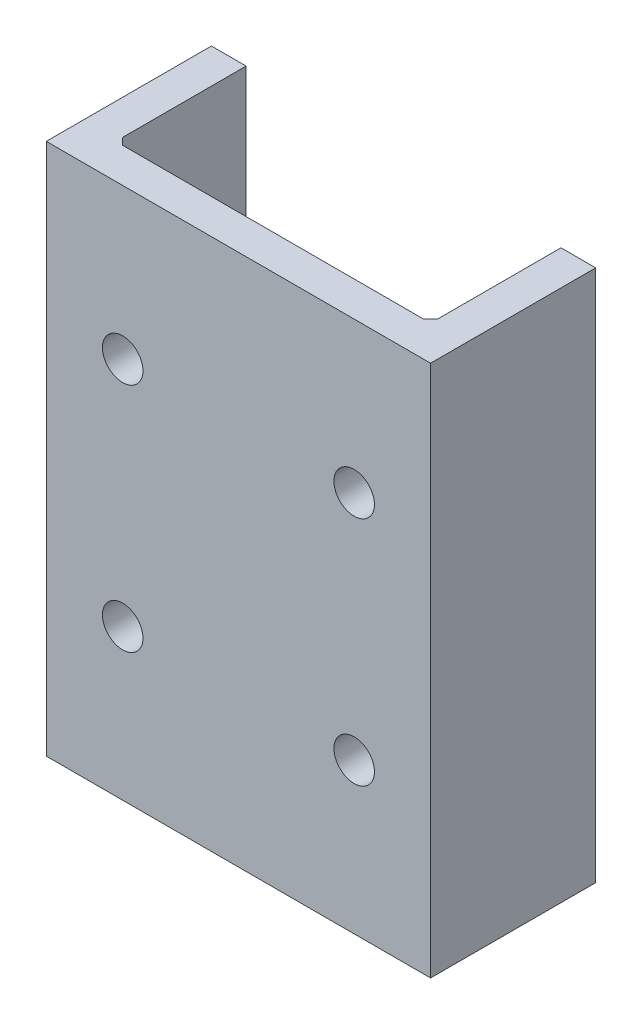
ISO-10303-21;
HEADER;
FILE_DESCRIPTION(('STEP AP214'),'2;1');
FILE_NAME('part.step','',(''),(''),'','','');
FILE_SCHEMA(('AUTOMOTIVE_DESIGN { 1 0 10303 214 1 1 1 1 }'));
ENDSEC;
DATA;
#1=APPLICATION_CONTEXT('core data for automotive mechanical design processes');
#2=APPLICATION_PROTOCOL_DEFINITION('international standard','automotive_design',2000,#1);
#3=PRODUCT_CONTEXT('',#1,'mechanical');
#4=PRODUCT('Part','Part','',(#3));
#5=PRODUCT_RELATED_PRODUCT_CATEGORY('part','',(#4));
#6=PRODUCT_DEFINITION_FORMATION('','',#4);
#7=PRODUCT_DEFINITION_CONTEXT('part definition',#1,'design');
#8=PRODUCT_DEFINITION('design','',#6,#7);
#9=PRODUCT_DEFINITION_SHAPE('','',#8);
#10=(LENGTH_UNIT() NAMED_UNIT(*) SI_UNIT(.MILLI.,.METRE.));
#11=(NAMED_UNIT(*) PLANE_ANGLE_UNIT() SI_UNIT($,.RADIAN.));
#12=(NAMED_UNIT(*) SI_UNIT($,.STERADIAN.) SOLID_ANGLE_UNIT());
#13=UNCERTAINTY_MEASURE_WITH_UNIT(LENGTH_MEASURE(1.E-05),#10,'distance_accuracy_value','');
#14=(GEOMETRIC_REPRESENTATION_CONTEXT(3) GLOBAL_UNCERTAINTY_ASSIGNED_CONTEXT((#13)) GLOBAL_UNIT_ASSIGNED_CONTEXT((#10,
#11,#12)) REPRESENTATION_CONTEXT('',''));
#15=CARTESIAN_POINT('',(0.,0.,0.));
#16=DIRECTION('',(0.,0.,1.));
#17=DIRECTION('',(1.,0.,0.));
#18=AXIS2_PLACEMENT_3D('',#15,#16,#17);
#19=CARTESIAN_POINT('',(-13.6,46.,-11.2660305343511));
#20=DIRECTION('',(0.,0.,1.));
#21=DIRECTION('',(1.,0.,0.));
#22=AXIS2_PLACEMENT_3D('',#19,#20,#21);
#23=PLANE('',#22);
#24=DIRECTION('',(-1.,0.,0.));
#25=VECTOR('',#24,1.);
#26=CARTESIAN_POINT('',(-13.6,0.,-11.2660305343511));
#27=LINE('',#26,#25);
#28=CARTESIAN_POINT('',(-13.6,0.,-11.2660305343511));
#29=VERTEX_POINT('',#28);
#30=CARTESIAN_POINT('',(-16.6,0.,-11.2660305343511));
#31=VERTEX_POINT('',#30);
#32=EDGE_CURVE('E149',#29,#31,#27,.T.);
#33=ORIENTED_EDGE('',*,*,#32,.T.);
#34=DIRECTION('',(0.,-1.,0.));
#35=VECTOR('',#34,1.);
#36=CARTESIAN_POINT('',(-16.6,46.,-11.2660305343511));
#37=LINE('',#36,#35);
#38=CARTESIAN_POINT('',(-16.6,46.,-11.2660305343511));
#39=VERTEX_POINT('',#38);
#40=EDGE_CURVE('E11',#39,#31,#37,.T.);
#41=ORIENTED_EDGE('',*,*,#40,.F.);
#42=DIRECTION('',(-1.,0.,0.));
#43=VECTOR('',#42,1.);
#44=CARTESIAN_POINT('',(-13.6,46.,-11.2660305343511));
#45=LINE('',#44,#43);
#46=CARTESIAN_POINT('',(-13.6,46.,-11.2660305343511));
#47=VERTEX_POINT('',#46);
#48=EDGE_CURVE('E168',#47,#39,#45,.T.);
#49=ORIENTED_EDGE('',*,*,#48,.F.);
#50=DIRECTION('',(0.,-1.,0.));
#51=VECTOR('',#50,1.);
#52=CARTESIAN_POINT('',(-13.6,46.,-11.2660305343511));
#53=LINE('',#52,#51);
#54=EDGE_CURVE('E145',#47,#29,#53,.T.);
#55=ORIENTED_EDGE('',*,*,#54,.T.);
#56=EDGE_LOOP('',(#33,#41,#49,#55));
#57=FACE_BOUND('',#56,.T.);
#58=ADVANCED_FACE('F41',(#57),#23,.F.);
#59=CARTESIAN_POINT('',(-16.6,46.,-11.2660305343511));
#60=DIRECTION('',(1.,0.,0.));
#61=DIRECTION('',(0.,0.,-1.));
#62=AXIS2_PLACEMENT_3D('',#59,#60,#61);
#63=PLANE('',#62);
#64=DIRECTION('',(0.,0.,1.));
#65=VECTOR('',#64,1.);
#66=CARTESIAN_POINT('',(-16.6,0.,-11.2660305343511));
#67=LINE('',#66,#65);
#68=CARTESIAN_POINT('',(-16.6,0.,3.));
#69=VERTEX_POINT('',#68);
#70=EDGE_CURVE('E152',#31,#69,#67,.T.);
#71=ORIENTED_EDGE('',*,*,#70,.T.);
#72=DIRECTION('',(0.,-1.,0.));
#73=VECTOR('',#72,1.);
#74=CARTESIAN_POINT('',(-16.6,46.,3.));
#75=LINE('',#74,#73);
#76=CARTESIAN_POINT('',(-16.6,46.,3.));
#77=VERTEX_POINT('',#76);
#78=EDGE_CURVE('E49',#77,#69,#75,.T.);
#79=ORIENTED_EDGE('',*,*,#78,.F.);
#80=DIRECTION('',(0.,0.,1.));
#81=VECTOR('',#80,1.);
#82=CARTESIAN_POINT('',(-16.6,46.,-11.2660305343511));
#83=LINE('',#82,#81);
#84=EDGE_CURVE('E106',#39,#77,#83,.T.);
#85=ORIENTED_EDGE('',*,*,#84,.F.);
#86=ORIENTED_EDGE('',*,*,#40,.T.);
#87=EDGE_LOOP('',(#71,#79,#85,#86));
#88=FACE_BOUND('',#87,.T.);
#89=ADVANCED_FACE('F263',(#88),#63,.F.);
#90=CARTESIAN_POINT('',(-16.6,46.,3.));
#91=DIRECTION('',(0.,0.,-1.));
#92=DIRECTION('',(-1.,0.,0.));
#93=AXIS2_PLACEMENT_3D('',#90,#91,#92);
#94=PLANE('',#93);
#95=CARTESIAN_POINT('',(-10.,13.,3.));
#96=DIRECTION('',(0.,0.,1.));
#97=DIRECTION('',(1.,0.,0.));
#98=AXIS2_PLACEMENT_3D('',#95,#96,#97);
#99=CIRCLE('',#98,1.75);
#100=CARTESIAN_POINT('',(-8.25,13.,3.));
#101=VERTEX_POINT('',#100);
#102=EDGE_CURVE('E221',#101,#101,#99,.T.);
#103=ORIENTED_EDGE('',*,*,#102,.F.);
#104=EDGE_LOOP('',(#103));
#105=FACE_BOUND('',#104,.T.);
#106=CARTESIAN_POINT('',(10.,13.,3.));
#107=DIRECTION('',(0.,0.,1.));
#108=DIRECTION('',(1.,0.,0.));
#109=AXIS2_PLACEMENT_3D('',#106,#107,#108);
#110=CIRCLE('',#109,1.75);
#111=CARTESIAN_POINT('',(11.75,13.,3.));
#112=VERTEX_POINT('',#111);
#113=EDGE_CURVE('E228',#112,#112,#110,.T.);
#114=ORIENTED_EDGE('',*,*,#113,.F.);
#115=EDGE_LOOP('',(#114));
#116=FACE_BOUND('',#115,.T.);
#117=CARTESIAN_POINT('',(10.,33.,3.));
#118=DIRECTION('',(0.,0.,1.));
#119=DIRECTION('',(1.,0.,0.));
#120=AXIS2_PLACEMENT_3D('',#117,#118,#119);
#121=CIRCLE('',#120,1.75);
#122=CARTESIAN_POINT('',(11.75,33.,3.));
#123=VERTEX_POINT('',#122);
#124=EDGE_CURVE('E220',#123,#123,#121,.T.);
#125=ORIENTED_EDGE('',*,*,#124,.F.);
#126=EDGE_LOOP('',(#125));
#127=FACE_BOUND('',#126,.T.);
#128=CARTESIAN_POINT('',(-10.,33.,3.));
#129=DIRECTION('',(0.,0.,1.));
#130=DIRECTION('',(1.,0.,0.));
#131=AXIS2_PLACEMENT_3D('',#128,#129,#130);
#132=CIRCLE('',#131,1.75);
#133=CARTESIAN_POINT('',(-8.25,33.,3.));
#134=VERTEX_POINT('',#133);
#135=EDGE_CURVE('E217',#134,#134,#132,.T.);
#136=ORIENTED_EDGE('',*,*,#135,.F.);
#137=EDGE_LOOP('',(#136));
#138=FACE_BOUND('',#137,.T.);
#139=DIRECTION('',(1.,0.,0.));
#140=VECTOR('',#139,1.);
#141=CARTESIAN_POINT('',(-16.6,0.,3.));
#142=LINE('',#141,#140);
#143=CARTESIAN_POINT('',(16.6,0.,3.));
#144=VERTEX_POINT('',#143);
#145=EDGE_CURVE('E155',#69,#144,#142,.T.);
#146=ORIENTED_EDGE('',*,*,#145,.T.);
#147=DIRECTION('',(0.,-1.,0.));
#148=VECTOR('',#147,1.);
#149=CARTESIAN_POINT('',(16.6,46.,3.));
#150=LINE('',#149,#148);
#151=CARTESIAN_POINT('',(16.6,46.,3.));
#152=VERTEX_POINT('',#151);
#153=EDGE_CURVE('E181',#152,#144,#150,.T.);
#154=ORIENTED_EDGE('',*,*,#153,.F.);
#155=DIRECTION('',(1.,0.,0.));
#156=VECTOR('',#155,1.);
#157=CARTESIAN_POINT('',(-16.6,46.,3.));
#158=LINE('',#157,#156);
#159=EDGE_CURVE('E189',#77,#152,#158,.T.);
#160=ORIENTED_EDGE('',*,*,#159,.F.);
#161=ORIENTED_EDGE('',*,*,#78,.T.);
#162=EDGE_LOOP('',(#146,#154,#160,#161));
#163=FACE_BOUND('',#162,.T.);
#164=ADVANCED_FACE('F187',(#105,#116,#127,#138,#163),#94,.F.);
#165=CARTESIAN_POINT('',(16.6,46.,3.));
#166=DIRECTION('',(-1.,0.,0.));
#167=DIRECTION('',(0.,0.,1.));
#168=AXIS2_PLACEMENT_3D('',#165,#166,#167);
#169=PLANE('',#168);
#170=DIRECTION('',(0.,0.,-1.));
#171=VECTOR('',#170,1.);
#172=CARTESIAN_POINT('',(16.6,0.,3.));
#173=LINE('',#172,#171);
#174=CARTESIAN_POINT('',(16.6,0.,-11.2660305343511));
#175=VERTEX_POINT('',#174);
#176=EDGE_CURVE('E157',#144,#175,#173,.T.);
#177=ORIENTED_EDGE('',*,*,#176,.T.);
#178=DIRECTION('',(0.,-1.,0.));
#179=VECTOR('',#178,1.);
#180=CARTESIAN_POINT('',(16.6,46.,-11.2660305343511));
#181=LINE('',#180,#179);
#182=CARTESIAN_POINT('',(16.6,46.,-11.2660305343511));
#183=VERTEX_POINT('',#182);
#184=EDGE_CURVE('E178',#183,#175,#181,.T.);
#185=ORIENTED_EDGE('',*,*,#184,.F.);
#186=DIRECTION('',(0.,0.,-1.));
#187=VECTOR('',#186,1.);
#188=CARTESIAN_POINT('',(16.6,46.,3.));
#189=LINE('',#188,#187);
#190=EDGE_CURVE('E207',#152,#183,#189,.T.);
#191=ORIENTED_EDGE('',*,*,#190,.F.);
#192=ORIENTED_EDGE('',*,*,#153,.T.);
#193=EDGE_LOOP('',(#177,#185,#191,#192));
#194=FACE_BOUND('',#193,.T.);
#195=ADVANCED_FACE('F198',(#194),#169,.F.);
#196=CARTESIAN_POINT('',(16.6,46.,-11.2660305343511));
#197=DIRECTION('',(0.,0.,1.));
#198=DIRECTION('',(1.,0.,0.));
#199=AXIS2_PLACEMENT_3D('',#196,#197,#198);
#200=PLANE('',#199);
#201=DIRECTION('',(-1.,0.,0.));
#202=VECTOR('',#201,1.);
#203=CARTESIAN_POINT('',(16.6,0.,-11.2660305343511));
#204=LINE('',#203,#202);
#205=CARTESIAN_POINT('',(13.6,0.,-11.2660305343511));
#206=VERTEX_POINT('',#205);
#207=EDGE_CURVE('E159',#175,#206,#204,.T.);
#208=ORIENTED_EDGE('',*,*,#207,.T.);
#209=DIRECTION('',(0.,-1.,0.));
#210=VECTOR('',#209,1.);
#211=CARTESIAN_POINT('',(13.6,46.,-11.2660305343511));
#212=LINE('',#211,#210);
#213=CARTESIAN_POINT('',(13.6,46.,-11.2660305343511));
#214=VERTEX_POINT('',#213);
#215=EDGE_CURVE('E175',#214,#206,#212,.T.);
#216=ORIENTED_EDGE('',*,*,#215,.F.);
#217=DIRECTION('',(-1.,0.,0.));
#218=VECTOR('',#217,1.);
#219=CARTESIAN_POINT('',(16.6,46.,-11.2660305343511));
#220=LINE('',#219,#218);
#221=EDGE_CURVE('E204',#183,#214,#220,.T.);
#222=ORIENTED_EDGE('',*,*,#221,.F.);
#223=ORIENTED_EDGE('',*,*,#184,.T.);
#224=EDGE_LOOP('',(#208,#216,#222,#223));
#225=FACE_BOUND('',#224,.T.);
#226=ADVANCED_FACE('F202',(#225),#200,.F.);
#227=CARTESIAN_POINT('',(13.6,46.,-0.599999999999994));
#228=DIRECTION('',(1.,0.,0.));
#229=DIRECTION('',(0.,0.,-1.));
#230=AXIS2_PLACEMENT_3D('',#227,#228,#229);
#231=PLANE('',#230);
#232=DIRECTION('',(0.,0.,1.));
#233=VECTOR('',#232,1.);
#234=CARTESIAN_POINT('',(13.6,0.,-0.599999999999994));
#235=LINE('',#234,#233);
#236=CARTESIAN_POINT('',(13.6,0.,-0.599999999999994));
#237=VERTEX_POINT('',#236);
#238=EDGE_CURVE('E161',#206,#237,#235,.T.);
#239=ORIENTED_EDGE('',*,*,#238,.T.);
#240=DIRECTION('',(0.,-1.,0.));
#241=VECTOR('',#240,1.);
#242=CARTESIAN_POINT('',(13.6,46.,-0.599999999999994));
#243=LINE('',#242,#241);
#244=CARTESIAN_POINT('',(13.6,46.,-0.599999999999994));
#245=VERTEX_POINT('',#244);
#246=EDGE_CURVE('E172',#245,#237,#243,.T.);
#247=ORIENTED_EDGE('',*,*,#246,.F.);
#248=DIRECTION('',(0.,0.,1.));
#249=VECTOR('',#248,1.);
#250=CARTESIAN_POINT('',(13.6,46.,-0.599999999999994));
#251=LINE('',#250,#249);
#252=EDGE_CURVE('E206',#214,#245,#251,.T.);
#253=ORIENTED_EDGE('',*,*,#252,.F.);
#254=ORIENTED_EDGE('',*,*,#215,.T.);
#255=EDGE_LOOP('',(#239,#247,#253,#254));
#256=FACE_BOUND('',#255,.T.);
#257=ADVANCED_FACE('F274',(#256),#231,.F.);
#258=CARTESIAN_POINT('',(13.,46.,0.));
#259=DIRECTION('',(0.707106781186545,0.,0.70710678118655));
#260=DIRECTION('',(0.70710678118655,0.,-0.707106781186545));
#261=AXIS2_PLACEMENT_3D('',#258,#259,#260);
#262=PLANE('',#261);
#263=DIRECTION('',(-0.70710678118655,0.,0.707106781186545));
#264=VECTOR('',#263,1.);
#265=CARTESIAN_POINT('',(13.,0.,0.));
#266=LINE('',#265,#264);
#267=CARTESIAN_POINT('',(13.,0.,0.));
#268=VERTEX_POINT('',#267);
#269=EDGE_CURVE('E163',#237,#268,#266,.T.);
#270=ORIENTED_EDGE('',*,*,#269,.T.);
#271=DIRECTION('',(0.,-1.,0.));
#272=VECTOR('',#271,1.);
#273=CARTESIAN_POINT('',(13.,46.,0.));
#274=LINE('',#273,#272);
#275=CARTESIAN_POINT('',(13.,46.,0.));
#276=VERTEX_POINT('',#275);
#277=EDGE_CURVE('E140',#276,#268,#274,.T.);
#278=ORIENTED_EDGE('',*,*,#277,.F.);
#279=DIRECTION('',(-0.70710678118655,0.,0.707106781186545));
#280=VECTOR('',#279,1.);
#281=CARTESIAN_POINT('',(13.,46.,0.));
#282=LINE('',#281,#280);
#283=EDGE_CURVE('E131',#245,#276,#282,.T.);
#284=ORIENTED_EDGE('',*,*,#283,.F.);
#285=ORIENTED_EDGE('',*,*,#246,.T.);
#286=EDGE_LOOP('',(#270,#278,#284,#285));
#287=FACE_BOUND('',#286,.T.);
#288=ADVANCED_FACE('F243',(#287),#262,.F.);
#289=CARTESIAN_POINT('',(-13.,46.,0.));
#290=DIRECTION('',(0.,0.,1.));
#291=DIRECTION('',(1.,0.,0.));
#292=AXIS2_PLACEMENT_3D('',#289,#290,#291);
#293=PLANE('',#292);
#294=CARTESIAN_POINT('',(-10.,13.,0.));
#295=DIRECTION('',(0.,0.,1.));
#296=DIRECTION('',(1.,0.,0.));
#297=AXIS2_PLACEMENT_3D('',#294,#295,#296);
#298=CIRCLE('',#297,1.75);
#299=CARTESIAN_POINT('',(-8.25,13.,0.));
#300=VERTEX_POINT('',#299);
#301=EDGE_CURVE('E225',#300,#300,#298,.F.);
#302=ORIENTED_EDGE('',*,*,#301,.F.);
#303=EDGE_LOOP('',(#302));
#304=FACE_BOUND('',#303,.T.);
#305=CARTESIAN_POINT('',(10.,13.,0.));
#306=DIRECTION('',(0.,0.,1.));
#307=DIRECTION('',(1.,0.,0.));
#308=AXIS2_PLACEMENT_3D('',#305,#306,#307);
#309=CIRCLE('',#308,1.75);
#310=CARTESIAN_POINT('',(11.75,13.,0.));
#311=VERTEX_POINT('',#310);
#312=EDGE_CURVE('E224',#311,#311,#309,.F.);
#313=ORIENTED_EDGE('',*,*,#312,.F.);
#314=EDGE_LOOP('',(#313));
#315=FACE_BOUND('',#314,.T.);
#316=CARTESIAN_POINT('',(10.,33.,0.));
#317=DIRECTION('',(0.,0.,1.));
#318=DIRECTION('',(1.,0.,0.));
#319=AXIS2_PLACEMENT_3D('',#316,#317,#318);
#320=CIRCLE('',#319,1.75);
#321=CARTESIAN_POINT('',(11.75,33.,0.));
#322=VERTEX_POINT('',#321);
#323=EDGE_CURVE('E231',#322,#322,#320,.F.);
#324=ORIENTED_EDGE('',*,*,#323,.F.);
#325=EDGE_LOOP('',(#324));
#326=FACE_BOUND('',#325,.T.);
#327=CARTESIAN_POINT('',(-10.,33.,0.));
#328=DIRECTION('',(0.,0.,1.));
#329=DIRECTION('',(1.,0.,0.));
#330=AXIS2_PLACEMENT_3D('',#327,#328,#329);
#331=CIRCLE('',#330,1.75);
#332=CARTESIAN_POINT('',(-8.25,33.,0.));
#333=VERTEX_POINT('',#332);
#334=EDGE_CURVE('E153',#333,#333,#331,.F.);
#335=ORIENTED_EDGE('',*,*,#334,.F.);
#336=EDGE_LOOP('',(#335));
#337=FACE_BOUND('',#336,.T.);
#338=DIRECTION('',(-1.,0.,0.));
#339=VECTOR('',#338,1.);
#340=CARTESIAN_POINT('',(-13.,0.,0.));
#341=LINE('',#340,#339);
#342=CARTESIAN_POINT('',(-13.,0.,0.));
#343=VERTEX_POINT('',#342);
#344=EDGE_CURVE('E139',#268,#343,#341,.T.);
#345=ORIENTED_EDGE('',*,*,#344,.T.);
#346=DIRECTION('',(0.,-1.,0.));
#347=VECTOR('',#346,1.);
#348=CARTESIAN_POINT('',(-13.,46.,0.));
#349=LINE('',#348,#347);
#350=CARTESIAN_POINT('',(-13.,46.,0.));
#351=VERTEX_POINT('',#350);
#352=EDGE_CURVE('E136',#351,#343,#349,.T.);
#353=ORIENTED_EDGE('',*,*,#352,.F.);
#354=DIRECTION('',(-1.,0.,0.));
#355=VECTOR('',#354,1.);
#356=CARTESIAN_POINT('',(-13.,46.,0.));
#357=LINE('',#356,#355);
#358=EDGE_CURVE('E125',#276,#351,#357,.T.);
#359=ORIENTED_EDGE('',*,*,#358,.F.);
#360=ORIENTED_EDGE('',*,*,#277,.T.);
#361=EDGE_LOOP('',(#345,#353,#359,#360));
#362=FACE_BOUND('',#361,.T.);
#363=ADVANCED_FACE('F137',(#304,#315,#326,#337,#362),#293,.F.);
#364=CARTESIAN_POINT('',(-13.6,46.,-0.599999999999999));
#365=DIRECTION('',(-0.707106781186548,0.,0.707106781186548));
#366=DIRECTION('',(0.707106781186548,0.,0.707106781186548));
#367=AXIS2_PLACEMENT_3D('',#364,#365,#366);
#368=PLANE('',#367);
#369=DIRECTION('',(-0.707106781186547,0.,-0.707106781186547));
#370=VECTOR('',#369,1.);
#371=CARTESIAN_POINT('',(-13.6,0.,-0.599999999999999));
#372=LINE('',#371,#370);
#373=CARTESIAN_POINT('',(-13.6,0.,-0.599999999999999));
#374=VERTEX_POINT('',#373);
#375=EDGE_CURVE('E92',#343,#374,#372,.T.);
#376=ORIENTED_EDGE('',*,*,#375,.T.);
#377=DIRECTION('',(0.,-1.,0.));
#378=VECTOR('',#377,1.);
#379=CARTESIAN_POINT('',(-13.6,46.,-0.599999999999999));
#380=LINE('',#379,#378);
#381=CARTESIAN_POINT('',(-13.6,46.,-0.599999999999999));
#382=VERTEX_POINT('',#381);
#383=EDGE_CURVE('E141',#382,#374,#380,.T.);
#384=ORIENTED_EDGE('',*,*,#383,.F.);
#385=DIRECTION('',(-0.707106781186547,0.,-0.707106781186547));
#386=VECTOR('',#385,1.);
#387=CARTESIAN_POINT('',(-13.6,46.,-0.599999999999999));
#388=LINE('',#387,#386);
#389=EDGE_CURVE('E129',#351,#382,#388,.T.);
#390=ORIENTED_EDGE('',*,*,#389,.F.);
#391=ORIENTED_EDGE('',*,*,#352,.T.);
#392=EDGE_LOOP('',(#376,#384,#390,#391));
#393=FACE_BOUND('',#392,.T.);
#394=ADVANCED_FACE('F143',(#393),#368,.F.);
#395=CARTESIAN_POINT('',(-13.6,46.,-11.2660305343511));
#396=DIRECTION('',(-1.,0.,0.));
#397=DIRECTION('',(0.,0.,1.));
#398=AXIS2_PLACEMENT_3D('',#395,#396,#397);
#399=PLANE('',#398);
#400=DIRECTION('',(0.,0.,-1.));
#401=VECTOR('',#400,1.);
#402=CARTESIAN_POINT('',(-13.6,0.,-11.2660305343511));
#403=LINE('',#402,#401);
#404=EDGE_CURVE('E98',#374,#29,#403,.T.);
#405=ORIENTED_EDGE('',*,*,#404,.T.);
#406=ORIENTED_EDGE('',*,*,#54,.F.);
#407=DIRECTION('',(0.,0.,-1.));
#408=VECTOR('',#407,1.);
#409=CARTESIAN_POINT('',(-13.6,46.,-11.2660305343511));
#410=LINE('',#409,#408);
#411=EDGE_CURVE('E57',#382,#47,#410,.T.);
#412=ORIENTED_EDGE('',*,*,#411,.F.);
#413=ORIENTED_EDGE('',*,*,#383,.T.);
#414=EDGE_LOOP('',(#405,#406,#412,#413));
#415=FACE_BOUND('',#414,.T.);
#416=ADVANCED_FACE('F342',(#415),#399,.F.);
#417=CARTESIAN_POINT('',(0.,46.,0.));
#418=DIRECTION('',(0.,1.,0.));
#419=DIRECTION('',(0.,0.,1.));
#420=AXIS2_PLACEMENT_3D('',#417,#418,#419);
#421=PLANE('',#420);
#422=ORIENTED_EDGE('',*,*,#48,.T.);
#423=ORIENTED_EDGE('',*,*,#84,.T.);
#424=ORIENTED_EDGE('',*,*,#159,.T.);
#425=ORIENTED_EDGE('',*,*,#190,.T.);
#426=ORIENTED_EDGE('',*,*,#221,.T.);
#427=ORIENTED_EDGE('',*,*,#252,.T.);
#428=ORIENTED_EDGE('',*,*,#283,.T.);
#429=ORIENTED_EDGE('',*,*,#358,.T.);
#430=ORIENTED_EDGE('',*,*,#389,.T.);
#431=ORIENTED_EDGE('',*,*,#411,.T.);
#432=EDGE_LOOP('',(#422,#423,#424,#425,#426,#427,#428,#429,#430,#431));
#433=FACE_BOUND('',#432,.T.);
#434=ADVANCED_FACE('F127',(#433),#421,.T.);
#435=CARTESIAN_POINT('',(0.,0.,0.));
#436=DIRECTION('',(0.,1.,0.));
#437=DIRECTION('',(0.,0.,1.));
#438=AXIS2_PLACEMENT_3D('',#435,#436,#437);
#439=PLANE('',#438);
#440=ORIENTED_EDGE('',*,*,#32,.F.);
#441=ORIENTED_EDGE('',*,*,#404,.F.);
#442=ORIENTED_EDGE('',*,*,#375,.F.);
#443=ORIENTED_EDGE('',*,*,#344,.F.);
#444=ORIENTED_EDGE('',*,*,#269,.F.);
#445=ORIENTED_EDGE('',*,*,#238,.F.);
#446=ORIENTED_EDGE('',*,*,#207,.F.);
#447=ORIENTED_EDGE('',*,*,#176,.F.);
#448=ORIENTED_EDGE('',*,*,#145,.F.);
#449=ORIENTED_EDGE('',*,*,#70,.F.);
#450=EDGE_LOOP('',(#440,#441,#442,#443,#444,#445,#446,#447,#448,#449));
#451=FACE_BOUND('',#450,.T.);
#452=ADVANCED_FACE('F193',(#451),#439,.F.);
#453=CARTESIAN_POINT('',(-10.,33.,-11.2670305343511));
#454=DIRECTION('',(0.,0.,1.));
#455=DIRECTION('',(1.,0.,0.));
#456=AXIS2_PLACEMENT_3D('',#453,#454,#455);
#457=CYLINDRICAL_SURFACE('',#456,1.75);
#458=CARTESIAN_POINT('',(-8.25,33.,3.));
#459=CARTESIAN_POINT('',(-8.25,33.,2.96875));
#460=CARTESIAN_POINT('',(-8.25,33.,2.9375));
#461=CARTESIAN_POINT('',(-8.25,33.,2.875));
#462=CARTESIAN_POINT('',(-8.25,33.,2.84375));
#463=CARTESIAN_POINT('',(-8.25,33.,2.78125));
#464=CARTESIAN_POINT('',(-8.25,33.,2.75));
#465=CARTESIAN_POINT('',(-8.25,33.,2.6875));
#466=CARTESIAN_POINT('',(-8.25,33.,2.65625));
#467=CARTESIAN_POINT('',(-8.25,33.,2.59375));
#468=CARTESIAN_POINT('',(-8.25,33.,2.5625));
#469=CARTESIAN_POINT('',(-8.25,33.,2.5));
#470=CARTESIAN_POINT('',(-8.25,33.,2.46875));
#471=CARTESIAN_POINT('',(-8.25,33.,2.40625));
#472=CARTESIAN_POINT('',(-8.25,33.,2.375));
#473=CARTESIAN_POINT('',(-8.25,33.,2.3125));
#474=CARTESIAN_POINT('',(-8.25,33.,2.28125));
#475=CARTESIAN_POINT('',(-8.25,33.,2.21875));
#476=CARTESIAN_POINT('',(-8.25,33.,2.1875));
#477=CARTESIAN_POINT('',(-8.25,33.,2.125));
#478=CARTESIAN_POINT('',(-8.25,33.,2.09375));
#479=CARTESIAN_POINT('',(-8.25,33.,2.03125));
#480=CARTESIAN_POINT('',(-8.25,33.,2.));
#481=CARTESIAN_POINT('',(-8.25,33.,1.9375));
#482=CARTESIAN_POINT('',(-8.25,33.,1.90625));
#483=CARTESIAN_POINT('',(-8.25,33.,1.84375));
#484=CARTESIAN_POINT('',(-8.25,33.,1.8125));
#485=CARTESIAN_POINT('',(-8.25,33.,1.75));
#486=CARTESIAN_POINT('',(-8.25,33.,1.71875));
#487=CARTESIAN_POINT('',(-8.25,33.,1.65625));
#488=CARTESIAN_POINT('',(-8.25,33.,1.625));
#489=CARTESIAN_POINT('',(-8.25,33.,1.5625));
#490=CARTESIAN_POINT('',(-8.25,33.,1.53125));
#491=CARTESIAN_POINT('',(-8.25,33.,1.46875));
#492=CARTESIAN_POINT('',(-8.25,33.,1.4375));
#493=CARTESIAN_POINT('',(-8.25,33.,1.375));
#494=CARTESIAN_POINT('',(-8.25,33.,1.34375));
#495=CARTESIAN_POINT('',(-8.25,33.,1.28125));
#496=CARTESIAN_POINT('',(-8.25,33.,1.25));
#497=CARTESIAN_POINT('',(-8.25,33.,1.1875));
#498=CARTESIAN_POINT('',(-8.25,33.,1.15625));
#499=CARTESIAN_POINT('',(-8.25,33.,1.09375));
#500=CARTESIAN_POINT('',(-8.25,33.,1.0625));
#501=CARTESIAN_POINT('',(-8.25,33.,1.));
#502=CARTESIAN_POINT('',(-8.25,33.,0.968750000000002));
#503=CARTESIAN_POINT('',(-8.25,33.,0.906250000000003));
#504=CARTESIAN_POINT('',(-8.25,33.,0.875000000000003));
#505=CARTESIAN_POINT('',(-8.25,33.,0.812500000000002));
#506=CARTESIAN_POINT('',(-8.25,33.,0.781250000000002));
#507=CARTESIAN_POINT('',(-8.25,33.,0.718750000000002));
#508=CARTESIAN_POINT('',(-8.25,33.,0.687500000000002));
#509=CARTESIAN_POINT('',(-8.25,33.,0.625000000000002));
#510=CARTESIAN_POINT('',(-8.25,33.,0.593750000000002));
#511=CARTESIAN_POINT('',(-8.25,33.,0.531250000000002));
#512=CARTESIAN_POINT('',(-8.25,33.,0.500000000000002));
#513=CARTESIAN_POINT('',(-8.25,33.,0.437500000000002));
#514=CARTESIAN_POINT('',(-8.25,33.,0.406250000000002));
#515=CARTESIAN_POINT('',(-8.25,33.,0.343750000000002));
#516=CARTESIAN_POINT('',(-8.25,33.,0.312500000000002));
#517=CARTESIAN_POINT('',(-8.25,33.,0.250000000000002));
#518=CARTESIAN_POINT('',(-8.25,33.,0.218750000000002));
#519=CARTESIAN_POINT('',(-8.25,33.,0.156250000000002));
#520=CARTESIAN_POINT('',(-8.25,33.,0.125000000000002));
#521=CARTESIAN_POINT('',(-8.25,33.,0.0625000000000018));
#522=CARTESIAN_POINT('',(-8.25,33.,0.0312500000000018));
#523=CARTESIAN_POINT('',(-8.25,33.,0.));
#524=B_SPLINE_CURVE_WITH_KNOTS('',3,(#458,#459,#460,#461,#462,#463,#464,#465,#466,#467,#468,
#469,#470,#471,#472,#473,#474,#475,#476,#477,#478,#479,#480,#481,#482,#483,#484,#485,#486,#487,
#488,#489,#490,#491,#492,#493,#494,#495,#496,#497,#498,#499,#500,#501,#502,#503,#504,#505,#506,
#507,#508,#509,#510,#511,#512,#513,#514,#515,#516,#517,#518,#519,#520,#521,#522,#523),
.UNSPECIFIED.,.F.,.F.,(4,2,2,2,2,2,2,2,2,2,2,2,2,2,2,2,2,2,2,2,2,2,2,2,2,2,2,2,2,2,2,2,4),(0.,
0.0937500000000001,0.1875,0.28125,0.375,0.46875,0.5625,0.656250000000001,0.750000000000001,
0.843749999999999,0.937499999999999,1.03125,1.125,1.21875,1.3125,1.40625,1.5,1.59375,1.6875,
1.78125,1.875,1.96875,2.0625,2.15625,2.25,2.34375,2.4375,2.53125,2.625,2.71875,2.8125,2.90625,
3.),.UNSPECIFIED.);
#525=EDGE_CURVE('BSEAM248',#134,#333,#524,.T.);
#526=ORIENTED_EDGE('',*,*,#135,.T.);
#527=ORIENTED_EDGE('',*,*,#334,.T.);
#528=ORIENTED_EDGE('',*,*,#525,.T.);
#529=ORIENTED_EDGE('',*,*,#525,.F.);
#530=EDGE_LOOP('',(#526,#528,#527,#529));
#531=FACE_BOUND('',#530,.T.);
#532=ADVANCED_FACE('F248',(#531),#457,.F.);
#533=CARTESIAN_POINT('',(10.,33.,-11.2670305343511));
#534=DIRECTION('',(0.,0.,1.));
#535=DIRECTION('',(1.,0.,0.));
#536=AXIS2_PLACEMENT_3D('',#533,#534,#535);
#537=CYLINDRICAL_SURFACE('',#536,1.75);
#538=CARTESIAN_POINT('',(11.75,33.,3.));
#539=CARTESIAN_POINT('',(11.75,33.,2.96875));
#540=CARTESIAN_POINT('',(11.75,33.,2.9375));
#541=CARTESIAN_POINT('',(11.75,33.,2.875));
#542=CARTESIAN_POINT('',(11.75,33.,2.84375));
#543=CARTESIAN_POINT('',(11.75,33.,2.78125));
#544=CARTESIAN_POINT('',(11.75,33.,2.75));
#545=CARTESIAN_POINT('',(11.75,33.,2.6875));
#546=CARTESIAN_POINT('',(11.75,33.,2.65625));
#547=CARTESIAN_POINT('',(11.75,33.,2.59375));
#548=CARTESIAN_POINT('',(11.75,33.,2.5625));
#549=CARTESIAN_POINT('',(11.75,33.,2.5));
#550=CARTESIAN_POINT('',(11.75,33.,2.46875));
#551=CARTESIAN_POINT('',(11.75,33.,2.40625));
#552=CARTESIAN_POINT('',(11.75,33.,2.375));
#553=CARTESIAN_POINT('',(11.75,33.,2.3125));
#554=CARTESIAN_POINT('',(11.75,33.,2.28125));
#555=CARTESIAN_POINT('',(11.75,33.,2.21875));
#556=CARTESIAN_POINT('',(11.75,33.,2.1875));
#557=CARTESIAN_POINT('',(11.75,33.,2.125));
#558=CARTESIAN_POINT('',(11.75,33.,2.09375));
#559=CARTESIAN_POINT('',(11.75,33.,2.03125));
#560=CARTESIAN_POINT('',(11.75,33.,2.));
#561=CARTESIAN_POINT('',(11.75,33.,1.9375));
#562=CARTESIAN_POINT('',(11.75,33.,1.90625));
#563=CARTESIAN_POINT('',(11.75,33.,1.84375));
#564=CARTESIAN_POINT('',(11.75,33.,1.8125));
#565=CARTESIAN_POINT('',(11.75,33.,1.75));
#566=CARTESIAN_POINT('',(11.75,33.,1.71875));
#567=CARTESIAN_POINT('',(11.75,33.,1.65625));
#568=CARTESIAN_POINT('',(11.75,33.,1.625));
#569=CARTESIAN_POINT('',(11.75,33.,1.5625));
#570=CARTESIAN_POINT('',(11.75,33.,1.53125));
#571=CARTESIAN_POINT('',(11.75,33.,1.46875));
#572=CARTESIAN_POINT('',(11.75,33.,1.4375));
#573=CARTESIAN_POINT('',(11.75,33.,1.375));
#574=CARTESIAN_POINT('',(11.75,33.,1.34375));
#575=CARTESIAN_POINT('',(11.75,33.,1.28125));
#576=CARTESIAN_POINT('',(11.75,33.,1.25));
#577=CARTESIAN_POINT('',(11.75,33.,1.1875));
#578=CARTESIAN_POINT('',(11.75,33.,1.15625));
#579=CARTESIAN_POINT('',(11.75,33.,1.09375));
#580=CARTESIAN_POINT('',(11.75,33.,1.0625));
#581=CARTESIAN_POINT('',(11.75,33.,1.));
#582=CARTESIAN_POINT('',(11.75,33.,0.968750000000002));
#583=CARTESIAN_POINT('',(11.75,33.,0.906250000000003));
#584=CARTESIAN_POINT('',(11.75,33.,0.875000000000003));
#585=CARTESIAN_POINT('',(11.75,33.,0.812500000000002));
#586=CARTESIAN_POINT('',(11.75,33.,0.781250000000002));
#587=CARTESIAN_POINT('',(11.75,33.,0.718750000000002));
#588=CARTESIAN_POINT('',(11.75,33.,0.687500000000002));
#589=CARTESIAN_POINT('',(11.75,33.,0.625000000000002));
#590=CARTESIAN_POINT('',(11.75,33.,0.593750000000002));
#591=CARTESIAN_POINT('',(11.75,33.,0.531250000000002));
#592=CARTESIAN_POINT('',(11.75,33.,0.500000000000002));
#593=CARTESIAN_POINT('',(11.75,33.,0.437500000000002));
#594=CARTESIAN_POINT('',(11.75,33.,0.406250000000002));
#595=CARTESIAN_POINT('',(11.75,33.,0.343750000000002));
#596=CARTESIAN_POINT('',(11.75,33.,0.312500000000002));
#597=CARTESIAN_POINT('',(11.75,33.,0.250000000000002));
#598=CARTESIAN_POINT('',(11.75,33.,0.218750000000002));
#599=CARTESIAN_POINT('',(11.75,33.,0.156250000000002));
#600=CARTESIAN_POINT('',(11.75,33.,0.125000000000002));
#601=CARTESIAN_POINT('',(11.75,33.,0.0625000000000018));
#602=CARTESIAN_POINT('',(11.75,33.,0.0312500000000018));
#603=CARTESIAN_POINT('',(11.75,33.,0.));
#604=B_SPLINE_CURVE_WITH_KNOTS('',3,(#538,#539,#540,#541,#542,#543,#544,#545,#546,#547,#548,
#549,#550,#551,#552,#553,#554,#555,#556,#557,#558,#559,#560,#561,#562,#563,#564,#565,#566,#567,
#568,#569,#570,#571,#572,#573,#574,#575,#576,#577,#578,#579,#580,#581,#582,#583,#584,#585,#586,
#587,#588,#589,#590,#591,#592,#593,#594,#595,#596,#597,#598,#599,#600,#601,#602,#603),
.UNSPECIFIED.,.F.,.F.,(4,2,2,2,2,2,2,2,2,2,2,2,2,2,2,2,2,2,2,2,2,2,2,2,2,2,2,2,2,2,2,2,4),(0.,
0.0937500000000001,0.1875,0.28125,0.375,0.46875,0.5625,0.656250000000001,0.750000000000001,
0.843749999999999,0.937499999999999,1.03125,1.125,1.21875,1.3125,1.40625,1.5,1.59375,1.6875,
1.78125,1.875,1.96875,2.0625,2.15625,2.25,2.34375,2.4375,2.53125,2.625,2.71875,2.8125,2.90625,
3.),.UNSPECIFIED.);
#605=EDGE_CURVE('BSEAM239',#123,#322,#604,.T.);
#606=ORIENTED_EDGE('',*,*,#124,.T.);
#607=ORIENTED_EDGE('',*,*,#323,.T.);
#608=ORIENTED_EDGE('',*,*,#605,.T.);
#609=ORIENTED_EDGE('',*,*,#605,.F.);
#610=EDGE_LOOP('',(#606,#608,#607,#609));
#611=FACE_BOUND('',#610,.T.);
#612=ADVANCED_FACE('F239',(#611),#537,.F.);
#613=CARTESIAN_POINT('',(10.,13.,-11.2670305343511));
#614=DIRECTION('',(0.,0.,1.));
#615=DIRECTION('',(1.,0.,0.));
#616=AXIS2_PLACEMENT_3D('',#613,#614,#615);
#617=CYLINDRICAL_SURFACE('',#616,1.75);
#618=CARTESIAN_POINT('',(11.75,13.,3.));
#619=CARTESIAN_POINT('',(11.75,13.,2.96875));
#620=CARTESIAN_POINT('',(11.75,13.,2.9375));
#621=CARTESIAN_POINT('',(11.75,13.,2.875));
#622=CARTESIAN_POINT('',(11.75,13.,2.84375));
#623=CARTESIAN_POINT('',(11.75,13.,2.78125));
#624=CARTESIAN_POINT('',(11.75,13.,2.75));
#625=CARTESIAN_POINT('',(11.75,13.,2.6875));
#626=CARTESIAN_POINT('',(11.75,13.,2.65625));
#627=CARTESIAN_POINT('',(11.75,13.,2.59375));
#628=CARTESIAN_POINT('',(11.75,13.,2.5625));
#629=CARTESIAN_POINT('',(11.75,13.,2.5));
#630=CARTESIAN_POINT('',(11.75,13.,2.46875));
#631=CARTESIAN_POINT('',(11.75,13.,2.40625));
#632=CARTESIAN_POINT('',(11.75,13.,2.375));
#633=CARTESIAN_POINT('',(11.75,13.,2.3125));
#634=CARTESIAN_POINT('',(11.75,13.,2.28125));
#635=CARTESIAN_POINT('',(11.75,13.,2.21875));
#636=CARTESIAN_POINT('',(11.75,13.,2.1875));
#637=CARTESIAN_POINT('',(11.75,13.,2.125));
#638=CARTESIAN_POINT('',(11.75,13.,2.09375));
#639=CARTESIAN_POINT('',(11.75,13.,2.03125));
#640=CARTESIAN_POINT('',(11.75,13.,2.));
#641=CARTESIAN_POINT('',(11.75,13.,1.9375));
#642=CARTESIAN_POINT('',(11.75,13.,1.90625));
#643=CARTESIAN_POINT('',(11.75,13.,1.84375));
#644=CARTESIAN_POINT('',(11.75,13.,1.8125));
#645=CARTESIAN_POINT('',(11.75,13.,1.75));
#646=CARTESIAN_POINT('',(11.75,13.,1.71875));
#647=CARTESIAN_POINT('',(11.75,13.,1.65625));
#648=CARTESIAN_POINT('',(11.75,13.,1.625));
#649=CARTESIAN_POINT('',(11.75,13.,1.5625));
#650=CARTESIAN_POINT('',(11.75,13.,1.53125));
#651=CARTESIAN_POINT('',(11.75,13.,1.46875));
#652=CARTESIAN_POINT('',(11.75,13.,1.4375));
#653=CARTESIAN_POINT('',(11.75,13.,1.375));
#654=CARTESIAN_POINT('',(11.75,13.,1.34375));
#655=CARTESIAN_POINT('',(11.75,13.,1.28125));
#656=CARTESIAN_POINT('',(11.75,13.,1.25));
#657=CARTESIAN_POINT('',(11.75,13.,1.1875));
#658=CARTESIAN_POINT('',(11.75,13.,1.15625));
#659=CARTESIAN_POINT('',(11.75,13.,1.09375));
#660=CARTESIAN_POINT('',(11.75,13.,1.0625));
#661=CARTESIAN_POINT('',(11.75,13.,1.));
#662=CARTESIAN_POINT('',(11.75,13.,0.968750000000002));
#663=CARTESIAN_POINT('',(11.75,13.,0.906250000000003));
#664=CARTESIAN_POINT('',(11.75,13.,0.875000000000003));
#665=CARTESIAN_POINT('',(11.75,13.,0.812500000000002));
#666=CARTESIAN_POINT('',(11.75,13.,0.781250000000002));
#667=CARTESIAN_POINT('',(11.75,13.,0.718750000000002));
#668=CARTESIAN_POINT('',(11.75,13.,0.687500000000002));
#669=CARTESIAN_POINT('',(11.75,13.,0.625000000000002));
#670=CARTESIAN_POINT('',(11.75,13.,0.593750000000002));
#671=CARTESIAN_POINT('',(11.75,13.,0.531250000000002));
#672=CARTESIAN_POINT('',(11.75,13.,0.500000000000002));
#673=CARTESIAN_POINT('',(11.75,13.,0.437500000000002));
#674=CARTESIAN_POINT('',(11.75,13.,0.406250000000002));
#675=CARTESIAN_POINT('',(11.75,13.,0.343750000000002));
#676=CARTESIAN_POINT('',(11.75,13.,0.312500000000002));
#677=CARTESIAN_POINT('',(11.75,13.,0.250000000000002));
#678=CARTESIAN_POINT('',(11.75,13.,0.218750000000002));
#679=CARTESIAN_POINT('',(11.75,13.,0.156250000000002));
#680=CARTESIAN_POINT('',(11.75,13.,0.125000000000002));
#681=CARTESIAN_POINT('',(11.75,13.,0.0625000000000018));
#682=CARTESIAN_POINT('',(11.75,13.,0.0312500000000018));
#683=CARTESIAN_POINT('',(11.75,13.,0.));
#684=B_SPLINE_CURVE_WITH_KNOTS('',3,(#618,#619,#620,#621,#622,#623,#624,#625,#626,#627,#628,
#629,#630,#631,#632,#633,#634,#635,#636,#637,#638,#639,#640,#641,#642,#643,#644,#645,#646,#647,
#648,#649,#650,#651,#652,#653,#654,#655,#656,#657,#658,#659,#660,#661,#662,#663,#664,#665,#666,
#667,#668,#669,#670,#671,#672,#673,#674,#675,#676,#677,#678,#679,#680,#681,#682,#683),
.UNSPECIFIED.,.F.,.F.,(4,2,2,2,2,2,2,2,2,2,2,2,2,2,2,2,2,2,2,2,2,2,2,2,2,2,2,2,2,2,2,2,4),(0.,
0.0937500000000001,0.1875,0.28125,0.375,0.46875,0.5625,0.656250000000001,0.750000000000001,
0.843749999999999,0.937499999999999,1.03125,1.125,1.21875,1.3125,1.40625,1.5,1.59375,1.6875,
1.78125,1.875,1.96875,2.0625,2.15625,2.25,2.34375,2.4375,2.53125,2.625,2.71875,2.8125,2.90625,
3.),.UNSPECIFIED.);
#685=EDGE_CURVE('BSEAM255',#112,#311,#684,.T.);
#686=ORIENTED_EDGE('',*,*,#113,.T.);
#687=ORIENTED_EDGE('',*,*,#312,.T.);
#688=ORIENTED_EDGE('',*,*,#685,.T.);
#689=ORIENTED_EDGE('',*,*,#685,.F.);
#690=EDGE_LOOP('',(#686,#688,#687,#689));
#691=FACE_BOUND('',#690,.T.);
#692=ADVANCED_FACE('F255',(#691),#617,.F.);
#693=CARTESIAN_POINT('',(-10.,13.,-11.2670305343511));
#694=DIRECTION('',(0.,0.,1.));
#695=DIRECTION('',(1.,0.,0.));
#696=AXIS2_PLACEMENT_3D('',#693,#694,#695);
#697=CYLINDRICAL_SURFACE('',#696,1.75);
#698=CARTESIAN_POINT('',(-8.25,13.,3.));
#699=CARTESIAN_POINT('',(-8.25,13.,2.96875));
#700=CARTESIAN_POINT('',(-8.25,13.,2.9375));
#701=CARTESIAN_POINT('',(-8.25,13.,2.875));
#702=CARTESIAN_POINT('',(-8.25,13.,2.84375));
#703=CARTESIAN_POINT('',(-8.25,13.,2.78125));
#704=CARTESIAN_POINT('',(-8.25,13.,2.75));
#705=CARTESIAN_POINT('',(-8.25,13.,2.6875));
#706=CARTESIAN_POINT('',(-8.25,13.,2.65625));
#707=CARTESIAN_POINT('',(-8.25,13.,2.59375));
#708=CARTESIAN_POINT('',(-8.25,13.,2.5625));
#709=CARTESIAN_POINT('',(-8.25,13.,2.5));
#710=CARTESIAN_POINT('',(-8.25,13.,2.46875));
#711=CARTESIAN_POINT('',(-8.25,13.,2.40625));
#712=CARTESIAN_POINT('',(-8.25,13.,2.375));
#713=CARTESIAN_POINT('',(-8.25,13.,2.3125));
#714=CARTESIAN_POINT('',(-8.25,13.,2.28125));
#715=CARTESIAN_POINT('',(-8.25,13.,2.21875));
#716=CARTESIAN_POINT('',(-8.25,13.,2.1875));
#717=CARTESIAN_POINT('',(-8.25,13.,2.125));
#718=CARTESIAN_POINT('',(-8.25,13.,2.09375));
#719=CARTESIAN_POINT('',(-8.25,13.,2.03125));
#720=CARTESIAN_POINT('',(-8.25,13.,2.));
#721=CARTESIAN_POINT('',(-8.25,13.,1.9375));
#722=CARTESIAN_POINT('',(-8.25,13.,1.90625));
#723=CARTESIAN_POINT('',(-8.25,13.,1.84375));
#724=CARTESIAN_POINT('',(-8.25,13.,1.8125));
#725=CARTESIAN_POINT('',(-8.25,13.,1.75));
#726=CARTESIAN_POINT('',(-8.25,13.,1.71875));
#727=CARTESIAN_POINT('',(-8.25,13.,1.65625));
#728=CARTESIAN_POINT('',(-8.25,13.,1.625));
#729=CARTESIAN_POINT('',(-8.25,13.,1.5625));
#730=CARTESIAN_POINT('',(-8.25,13.,1.53125));
#731=CARTESIAN_POINT('',(-8.25,13.,1.46875));
#732=CARTESIAN_POINT('',(-8.25,13.,1.4375));
#733=CARTESIAN_POINT('',(-8.25,13.,1.375));
#734=CARTESIAN_POINT('',(-8.25,13.,1.34375));
#735=CARTESIAN_POINT('',(-8.25,13.,1.28125));
#736=CARTESIAN_POINT('',(-8.25,13.,1.25));
#737=CARTESIAN_POINT('',(-8.25,13.,1.1875));
#738=CARTESIAN_POINT('',(-8.25,13.,1.15625));
#739=CARTESIAN_POINT('',(-8.25,13.,1.09375));
#740=CARTESIAN_POINT('',(-8.25,13.,1.0625));
#741=CARTESIAN_POINT('',(-8.25,13.,1.));
#742=CARTESIAN_POINT('',(-8.25,13.,0.968750000000002));
#743=CARTESIAN_POINT('',(-8.25,13.,0.906250000000003));
#744=CARTESIAN_POINT('',(-8.25,13.,0.875000000000003));
#745=CARTESIAN_POINT('',(-8.25,13.,0.812500000000002));
#746=CARTESIAN_POINT('',(-8.25,13.,0.781250000000002));
#747=CARTESIAN_POINT('',(-8.25,13.,0.718750000000002));
#748=CARTESIAN_POINT('',(-8.25,13.,0.687500000000002));
#749=CARTESIAN_POINT('',(-8.25,13.,0.625000000000002));
#750=CARTESIAN_POINT('',(-8.25,13.,0.593750000000002));
#751=CARTESIAN_POINT('',(-8.25,13.,0.531250000000002));
#752=CARTESIAN_POINT('',(-8.25,13.,0.500000000000002));
#753=CARTESIAN_POINT('',(-8.25,13.,0.437500000000002));
#754=CARTESIAN_POINT('',(-8.25,13.,0.406250000000002));
#755=CARTESIAN_POINT('',(-8.25,13.,0.343750000000002));
#756=CARTESIAN_POINT('',(-8.25,13.,0.312500000000002));
#757=CARTESIAN_POINT('',(-8.25,13.,0.250000000000002));
#758=CARTESIAN_POINT('',(-8.25,13.,0.218750000000002));
#759=CARTESIAN_POINT('',(-8.25,13.,0.156250000000002));
#760=CARTESIAN_POINT('',(-8.25,13.,0.125000000000002));
#761=CARTESIAN_POINT('',(-8.25,13.,0.0625000000000018));
#762=CARTESIAN_POINT('',(-8.25,13.,0.0312500000000018));
#763=CARTESIAN_POINT('',(-8.25,13.,0.));
#764=B_SPLINE_CURVE_WITH_KNOTS('',3,(#698,#699,#700,#701,#702,#703,#704,#705,#706,#707,#708,
#709,#710,#711,#712,#713,#714,#715,#716,#717,#718,#719,#720,#721,#722,#723,#724,#725,#726,#727,
#728,#729,#730,#731,#732,#733,#734,#735,#736,#737,#738,#739,#740,#741,#742,#743,#744,#745,#746,
#747,#748,#749,#750,#751,#752,#753,#754,#755,#756,#757,#758,#759,#760,#761,#762,#763),
.UNSPECIFIED.,.F.,.F.,(4,2,2,2,2,2,2,2,2,2,2,2,2,2,2,2,2,2,2,2,2,2,2,2,2,2,2,2,2,2,2,2,4),(0.,
0.0937500000000001,0.1875,0.28125,0.375,0.46875,0.5625,0.656250000000001,0.750000000000001,
0.843749999999999,0.937499999999999,1.03125,1.125,1.21875,1.3125,1.40625,1.5,1.59375,1.6875,
1.78125,1.875,1.96875,2.0625,2.15625,2.25,2.34375,2.4375,2.53125,2.625,2.71875,2.8125,2.90625,
3.),.UNSPECIFIED.);
#765=EDGE_CURVE('BSEAM300',#101,#300,#764,.T.);
#766=ORIENTED_EDGE('',*,*,#102,.T.);
#767=ORIENTED_EDGE('',*,*,#301,.T.);
#768=ORIENTED_EDGE('',*,*,#765,.T.);
#769=ORIENTED_EDGE('',*,*,#765,.F.);
#770=EDGE_LOOP('',(#766,#768,#767,#769));
#771=FACE_BOUND('',#770,.T.);
#772=ADVANCED_FACE('F300',(#771),#697,.F.);
#773=CLOSED_SHELL('',(#58,#89,#164,#195,#226,#257,#288,#363,#394,#416,#434,#452,#532,#612,#692,#772));
#774=MANIFOLD_SOLID_BREP('B2',#773);
#775=ADVANCED_BREP_SHAPE_REPRESENTATION('',(#18,#774),#14);
#776=SHAPE_DEFINITION_REPRESENTATION(#9,#775);
ENDSEC;
END-ISO-10303-21;
